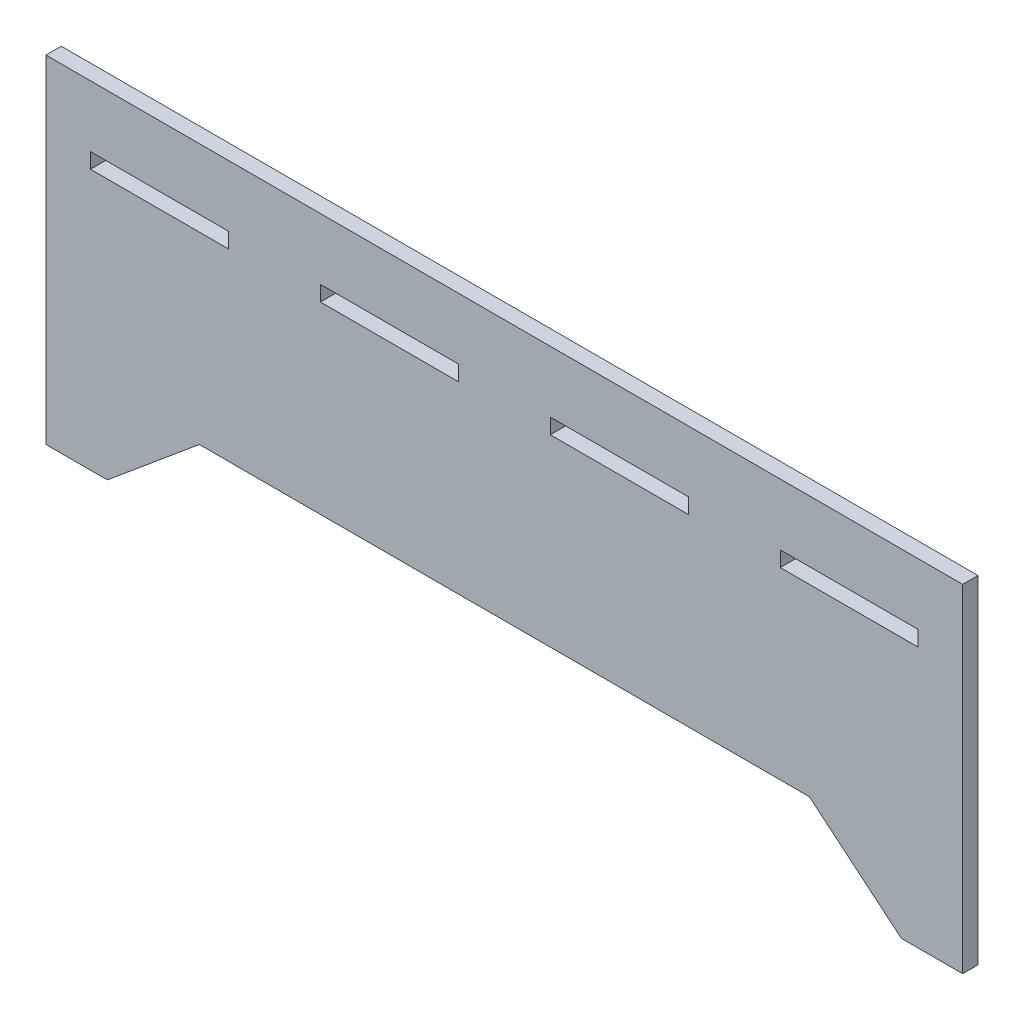
ISO-10303-21;
HEADER;
FILE_DESCRIPTION(('STEP AP214'),'2;1');
FILE_NAME('part.step','',(''),(''),'','','');
FILE_SCHEMA(('AUTOMOTIVE_DESIGN { 1 0 10303 214 1 1 1 1 }'));
ENDSEC;
DATA;
#1=APPLICATION_CONTEXT('core data for automotive mechanical design processes');
#2=APPLICATION_PROTOCOL_DEFINITION('international standard','automotive_design',2000,#1);
#3=PRODUCT_CONTEXT('',#1,'mechanical');
#4=PRODUCT('Part','Part','',(#3));
#5=PRODUCT_RELATED_PRODUCT_CATEGORY('part','',(#4));
#6=PRODUCT_DEFINITION_FORMATION('','',#4);
#7=PRODUCT_DEFINITION_CONTEXT('part definition',#1,'design');
#8=PRODUCT_DEFINITION('design','',#6,#7);
#9=PRODUCT_DEFINITION_SHAPE('','',#8);
#10=(LENGTH_UNIT() NAMED_UNIT(*) SI_UNIT(.MILLI.,.METRE.));
#11=(NAMED_UNIT(*) PLANE_ANGLE_UNIT() SI_UNIT($,.RADIAN.));
#12=(NAMED_UNIT(*) SI_UNIT($,.STERADIAN.) SOLID_ANGLE_UNIT());
#13=UNCERTAINTY_MEASURE_WITH_UNIT(LENGTH_MEASURE(1.E-05),#10,'distance_accuracy_value','');
#14=(GEOMETRIC_REPRESENTATION_CONTEXT(3) GLOBAL_UNCERTAINTY_ASSIGNED_CONTEXT((#13)) GLOBAL_UNIT_ASSIGNED_CONTEXT((#10,
#11,#12)) REPRESENTATION_CONTEXT('',''));
#15=CARTESIAN_POINT('',(0.,0.,0.));
#16=DIRECTION('',(0.,0.,1.));
#17=DIRECTION('',(1.,0.,0.));
#18=AXIS2_PLACEMENT_3D('',#15,#16,#17);
#19=CARTESIAN_POINT('',(0.,0.,10.));
#20=DIRECTION('',(0.,0.,1.));
#21=DIRECTION('',(1.,0.,0.));
#22=AXIS2_PLACEMENT_3D('',#19,#20,#21);
#23=PLANE('',#22);
#24=DIRECTION('',(1.,0.,0.));
#25=VECTOR('',#24,1.);
#26=CARTESIAN_POINT('',(29.,120.,10.));
#27=LINE('',#26,#25);
#28=CARTESIAN_POINT('',(29.,120.,10.));
#29=VERTEX_POINT('',#28);
#30=CARTESIAN_POINT('',(119.,120.,10.));
#31=VERTEX_POINT('',#30);
#32=EDGE_CURVE('E232',#29,#31,#27,.T.);
#33=ORIENTED_EDGE('',*,*,#32,.F.);
#34=DIRECTION('',(0.,-1.,0.));
#35=VECTOR('',#34,1.);
#36=CARTESIAN_POINT('',(29.,130.,10.));
#37=LINE('',#36,#35);
#38=CARTESIAN_POINT('',(29.,130.,10.));
#39=VERTEX_POINT('',#38);
#40=EDGE_CURVE('E230',#39,#29,#37,.T.);
#41=ORIENTED_EDGE('',*,*,#40,.F.);
#42=DIRECTION('',(-1.,0.,0.));
#43=VECTOR('',#42,1.);
#44=CARTESIAN_POINT('',(29.,130.,10.));
#45=LINE('',#44,#43);
#46=CARTESIAN_POINT('',(119.,130.,10.));
#47=VERTEX_POINT('',#46);
#48=EDGE_CURVE('E238',#47,#39,#45,.T.);
#49=ORIENTED_EDGE('',*,*,#48,.F.);
#50=DIRECTION('',(0.,1.,0.));
#51=VECTOR('',#50,1.);
#52=CARTESIAN_POINT('',(119.,130.,10.));
#53=LINE('',#52,#51);
#54=EDGE_CURVE('E235',#31,#47,#53,.T.);
#55=ORIENTED_EDGE('',*,*,#54,.F.);
#56=EDGE_LOOP('',(#33,#41,#49,#55));
#57=FACE_BOUND('',#56,.T.);
#58=DIRECTION('',(1.,0.,0.));
#59=VECTOR('',#58,1.);
#60=CARTESIAN_POINT('',(179.,120.,10.));
#61=LINE('',#60,#59);
#62=CARTESIAN_POINT('',(179.,120.,10.));
#63=VERTEX_POINT('',#62);
#64=CARTESIAN_POINT('',(269.,120.,10.));
#65=VERTEX_POINT('',#64);
#66=EDGE_CURVE('E294',#63,#65,#61,.T.);
#67=ORIENTED_EDGE('',*,*,#66,.F.);
#68=DIRECTION('',(0.,-1.,0.));
#69=VECTOR('',#68,1.);
#70=CARTESIAN_POINT('',(179.,130.,10.));
#71=LINE('',#70,#69);
#72=CARTESIAN_POINT('',(179.,130.,10.));
#73=VERTEX_POINT('',#72);
#74=EDGE_CURVE('E292',#73,#63,#71,.T.);
#75=ORIENTED_EDGE('',*,*,#74,.F.);
#76=DIRECTION('',(-1.,0.,0.));
#77=VECTOR('',#76,1.);
#78=CARTESIAN_POINT('',(179.,130.,10.));
#79=LINE('',#78,#77);
#80=CARTESIAN_POINT('',(269.,130.,10.));
#81=VERTEX_POINT('',#80);
#82=EDGE_CURVE('E300',#81,#73,#79,.T.);
#83=ORIENTED_EDGE('',*,*,#82,.F.);
#84=DIRECTION('',(0.,1.,0.));
#85=VECTOR('',#84,1.);
#86=CARTESIAN_POINT('',(269.,130.,10.));
#87=LINE('',#86,#85);
#88=EDGE_CURVE('E297',#65,#81,#87,.T.);
#89=ORIENTED_EDGE('',*,*,#88,.F.);
#90=EDGE_LOOP('',(#67,#75,#83,#89));
#91=FACE_BOUND('',#90,.T.);
#92=DIRECTION('',(0.,-1.,0.));
#93=VECTOR('',#92,1.);
#94=CARTESIAN_POINT('',(0.,0.,10.));
#95=LINE('',#94,#93);
#96=CARTESIAN_POINT('',(0.,170.,10.));
#97=VERTEX_POINT('',#96);
#98=CARTESIAN_POINT('',(0.,-50.,10.));
#99=VERTEX_POINT('',#98);
#100=EDGE_CURVE('E323',#97,#99,#95,.T.);
#101=ORIENTED_EDGE('',*,*,#100,.T.);
#102=DIRECTION('',(1.,0.,0.));
#103=VECTOR('',#102,1.);
#104=CARTESIAN_POINT('',(0.,-50.,10.));
#105=LINE('',#104,#103);
#106=CARTESIAN_POINT('',(40.,-50.,10.));
#107=VERTEX_POINT('',#106);
#108=EDGE_CURVE('E326',#99,#107,#105,.T.);
#109=ORIENTED_EDGE('',*,*,#108,.T.);
#110=DIRECTION('',(0.768221279597376,0.64018439966448,0.));
#111=VECTOR('',#110,1.);
#112=CARTESIAN_POINT('',(40.,-50.,10.));
#113=LINE('',#112,#111);
#114=CARTESIAN_POINT('',(100.,0.,10.));
#115=VERTEX_POINT('',#114);
#116=EDGE_CURVE('E329',#107,#115,#113,.T.);
#117=ORIENTED_EDGE('',*,*,#116,.T.);
#118=DIRECTION('',(1.,0.,0.));
#119=VECTOR('',#118,1.);
#120=CARTESIAN_POINT('',(100.,0.,10.));
#121=LINE('',#120,#119);
#122=CARTESIAN_POINT('',(498.,0.,10.));
#123=VERTEX_POINT('',#122);
#124=EDGE_CURVE('E331',#115,#123,#121,.T.);
#125=ORIENTED_EDGE('',*,*,#124,.T.);
#126=DIRECTION('',(0.768221279597376,-0.640184399664479,0.));
#127=VECTOR('',#126,1.);
#128=CARTESIAN_POINT('',(558.,-50.,10.));
#129=LINE('',#128,#127);
#130=CARTESIAN_POINT('',(558.,-50.,10.));
#131=VERTEX_POINT('',#130);
#132=EDGE_CURVE('E333',#123,#131,#129,.T.);
#133=ORIENTED_EDGE('',*,*,#132,.T.);
#134=DIRECTION('',(1.,0.,0.));
#135=VECTOR('',#134,1.);
#136=CARTESIAN_POINT('',(598.,-50.,10.));
#137=LINE('',#136,#135);
#138=CARTESIAN_POINT('',(598.,-50.,10.));
#139=VERTEX_POINT('',#138);
#140=EDGE_CURVE('E335',#131,#139,#137,.T.);
#141=ORIENTED_EDGE('',*,*,#140,.T.);
#142=DIRECTION('',(0.,1.,0.));
#143=VECTOR('',#142,1.);
#144=CARTESIAN_POINT('',(598.,0.,10.));
#145=LINE('',#144,#143);
#146=CARTESIAN_POINT('',(598.,170.,10.));
#147=VERTEX_POINT('',#146);
#148=EDGE_CURVE('E337',#139,#147,#145,.T.);
#149=ORIENTED_EDGE('',*,*,#148,.T.);
#150=DIRECTION('',(-1.,0.,0.));
#151=VECTOR('',#150,1.);
#152=CARTESIAN_POINT('',(0.,170.,10.));
#153=LINE('',#152,#151);
#154=EDGE_CURVE('E339',#147,#97,#153,.T.);
#155=ORIENTED_EDGE('',*,*,#154,.T.);
#156=EDGE_LOOP('',(#101,#109,#117,#125,#133,#141,#149,#155));
#157=FACE_BOUND('',#156,.T.);
#158=DIRECTION('',(1.,0.,0.));
#159=VECTOR('',#158,1.);
#160=CARTESIAN_POINT('',(329.,120.,10.));
#161=LINE('',#160,#159);
#162=CARTESIAN_POINT('',(329.,120.,10.));
#163=VERTEX_POINT('',#162);
#164=CARTESIAN_POINT('',(419.,120.,10.));
#165=VERTEX_POINT('',#164);
#166=EDGE_CURVE('E263',#163,#165,#161,.T.);
#167=ORIENTED_EDGE('',*,*,#166,.F.);
#168=DIRECTION('',(0.,-1.,0.));
#169=VECTOR('',#168,1.);
#170=CARTESIAN_POINT('',(329.,130.,10.));
#171=LINE('',#170,#169);
#172=CARTESIAN_POINT('',(329.,130.,10.));
#173=VERTEX_POINT('',#172);
#174=EDGE_CURVE('E261',#173,#163,#171,.T.);
#175=ORIENTED_EDGE('',*,*,#174,.F.);
#176=DIRECTION('',(-1.,0.,0.));
#177=VECTOR('',#176,1.);
#178=CARTESIAN_POINT('',(329.,130.,10.));
#179=LINE('',#178,#177);
#180=CARTESIAN_POINT('',(419.,130.,10.));
#181=VERTEX_POINT('',#180);
#182=EDGE_CURVE('E269',#181,#173,#179,.T.);
#183=ORIENTED_EDGE('',*,*,#182,.F.);
#184=DIRECTION('',(0.,1.,0.));
#185=VECTOR('',#184,1.);
#186=CARTESIAN_POINT('',(419.,130.,10.));
#187=LINE('',#186,#185);
#188=EDGE_CURVE('E266',#165,#181,#187,.T.);
#189=ORIENTED_EDGE('',*,*,#188,.F.);
#190=EDGE_LOOP('',(#167,#175,#183,#189));
#191=FACE_BOUND('',#190,.T.);
#192=DIRECTION('',(1.,0.,0.));
#193=VECTOR('',#192,1.);
#194=CARTESIAN_POINT('',(479.,120.,10.));
#195=LINE('',#194,#193);
#196=CARTESIAN_POINT('',(479.,120.,10.));
#197=VERTEX_POINT('',#196);
#198=CARTESIAN_POINT('',(569.,120.,10.));
#199=VERTEX_POINT('',#198);
#200=EDGE_CURVE('E202',#197,#199,#195,.T.);
#201=ORIENTED_EDGE('',*,*,#200,.F.);
#202=DIRECTION('',(0.,-1.,0.));
#203=VECTOR('',#202,1.);
#204=CARTESIAN_POINT('',(479.,130.,10.));
#205=LINE('',#204,#203);
#206=CARTESIAN_POINT('',(479.,130.,10.));
#207=VERTEX_POINT('',#206);
#208=EDGE_CURVE('E194',#207,#197,#205,.T.);
#209=ORIENTED_EDGE('',*,*,#208,.F.);
#210=DIRECTION('',(-1.,0.,0.));
#211=VECTOR('',#210,1.);
#212=CARTESIAN_POINT('',(479.,130.,10.));
#213=LINE('',#212,#211);
#214=CARTESIAN_POINT('',(569.,130.,10.));
#215=VERTEX_POINT('',#214);
#216=EDGE_CURVE('E216',#215,#207,#213,.T.);
#217=ORIENTED_EDGE('',*,*,#216,.F.);
#218=DIRECTION('',(0.,1.,0.));
#219=VECTOR('',#218,1.);
#220=CARTESIAN_POINT('',(569.,130.,10.));
#221=LINE('',#220,#219);
#222=EDGE_CURVE('E214',#199,#215,#221,.T.);
#223=ORIENTED_EDGE('',*,*,#222,.F.);
#224=EDGE_LOOP('',(#201,#209,#217,#223));
#225=FACE_BOUND('',#224,.T.);
#226=ADVANCED_FACE('F33',(#57,#91,#157,#191,#225),#23,.T.);
#227=CARTESIAN_POINT('',(0.,0.,0.));
#228=DIRECTION('',(0.,0.,1.));
#229=DIRECTION('',(1.,0.,0.));
#230=AXIS2_PLACEMENT_3D('',#227,#228,#229);
#231=PLANE('',#230);
#232=DIRECTION('',(0.,-1.,0.));
#233=VECTOR('',#232,1.);
#234=CARTESIAN_POINT('',(29.,130.,0.));
#235=LINE('',#234,#233);
#236=CARTESIAN_POINT('',(29.,130.,0.));
#237=VERTEX_POINT('',#236);
#238=CARTESIAN_POINT('',(29.,120.,0.));
#239=VERTEX_POINT('',#238);
#240=EDGE_CURVE('E210',#237,#239,#235,.T.);
#241=ORIENTED_EDGE('',*,*,#240,.T.);
#242=DIRECTION('',(1.,0.,0.));
#243=VECTOR('',#242,1.);
#244=CARTESIAN_POINT('',(29.,120.,0.));
#245=LINE('',#244,#243);
#246=CARTESIAN_POINT('',(119.,120.,0.));
#247=VERTEX_POINT('',#246);
#248=EDGE_CURVE('E243',#239,#247,#245,.T.);
#249=ORIENTED_EDGE('',*,*,#248,.T.);
#250=DIRECTION('',(0.,1.,0.));
#251=VECTOR('',#250,1.);
#252=CARTESIAN_POINT('',(119.,130.,0.));
#253=LINE('',#252,#251);
#254=CARTESIAN_POINT('',(119.,130.,0.));
#255=VERTEX_POINT('',#254);
#256=EDGE_CURVE('E246',#247,#255,#253,.T.);
#257=ORIENTED_EDGE('',*,*,#256,.T.);
#258=DIRECTION('',(-1.,0.,0.));
#259=VECTOR('',#258,1.);
#260=CARTESIAN_POINT('',(29.,130.,0.));
#261=LINE('',#260,#259);
#262=EDGE_CURVE('E233',#255,#237,#261,.T.);
#263=ORIENTED_EDGE('',*,*,#262,.T.);
#264=EDGE_LOOP('',(#241,#249,#257,#263));
#265=FACE_BOUND('',#264,.T.);
#266=DIRECTION('',(0.,-1.,0.));
#267=VECTOR('',#266,1.);
#268=CARTESIAN_POINT('',(179.,130.,0.));
#269=LINE('',#268,#267);
#270=CARTESIAN_POINT('',(179.,130.,0.));
#271=VERTEX_POINT('',#270);
#272=CARTESIAN_POINT('',(179.,120.,0.));
#273=VERTEX_POINT('',#272);
#274=EDGE_CURVE('E291',#271,#273,#269,.T.);
#275=ORIENTED_EDGE('',*,*,#274,.T.);
#276=DIRECTION('',(1.,0.,0.));
#277=VECTOR('',#276,1.);
#278=CARTESIAN_POINT('',(179.,120.,0.));
#279=LINE('',#278,#277);
#280=CARTESIAN_POINT('',(269.,120.,0.));
#281=VERTEX_POINT('',#280);
#282=EDGE_CURVE('E305',#273,#281,#279,.T.);
#283=ORIENTED_EDGE('',*,*,#282,.T.);
#284=DIRECTION('',(0.,1.,0.));
#285=VECTOR('',#284,1.);
#286=CARTESIAN_POINT('',(269.,130.,0.));
#287=LINE('',#286,#285);
#288=CARTESIAN_POINT('',(269.,130.,0.));
#289=VERTEX_POINT('',#288);
#290=EDGE_CURVE('E308',#281,#289,#287,.T.);
#291=ORIENTED_EDGE('',*,*,#290,.T.);
#292=DIRECTION('',(-1.,0.,0.));
#293=VECTOR('',#292,1.);
#294=CARTESIAN_POINT('',(179.,130.,0.));
#295=LINE('',#294,#293);
#296=EDGE_CURVE('E295',#289,#271,#295,.T.);
#297=ORIENTED_EDGE('',*,*,#296,.T.);
#298=EDGE_LOOP('',(#275,#283,#291,#297));
#299=FACE_BOUND('',#298,.T.);
#300=DIRECTION('',(1.,0.,0.));
#301=VECTOR('',#300,1.);
#302=CARTESIAN_POINT('',(0.,-50.,0.));
#303=LINE('',#302,#301);
#304=CARTESIAN_POINT('',(0.,-50.,0.));
#305=VERTEX_POINT('',#304);
#306=CARTESIAN_POINT('',(40.,-50.,0.));
#307=VERTEX_POINT('',#306);
#308=EDGE_CURVE('E322',#305,#307,#303,.T.);
#309=ORIENTED_EDGE('',*,*,#308,.F.);
#310=DIRECTION('',(0.,-1.,0.));
#311=VECTOR('',#310,1.);
#312=CARTESIAN_POINT('',(0.,0.,0.));
#313=LINE('',#312,#311);
#314=CARTESIAN_POINT('',(0.,170.,0.));
#315=VERTEX_POINT('',#314);
#316=EDGE_CURVE('E327',#315,#305,#313,.T.);
#317=ORIENTED_EDGE('',*,*,#316,.F.);
#318=DIRECTION('',(-1.,0.,0.));
#319=VECTOR('',#318,1.);
#320=CARTESIAN_POINT('',(0.,170.,0.));
#321=LINE('',#320,#319);
#322=CARTESIAN_POINT('',(598.,170.,0.));
#323=VERTEX_POINT('',#322);
#324=EDGE_CURVE('E355',#323,#315,#321,.T.);
#325=ORIENTED_EDGE('',*,*,#324,.F.);
#326=DIRECTION('',(0.,1.,0.));
#327=VECTOR('',#326,1.);
#328=CARTESIAN_POINT('',(598.,0.,0.));
#329=LINE('',#328,#327);
#330=CARTESIAN_POINT('',(598.,-50.,0.));
#331=VERTEX_POINT('',#330);
#332=EDGE_CURVE('E353',#331,#323,#329,.T.);
#333=ORIENTED_EDGE('',*,*,#332,.F.);
#334=DIRECTION('',(1.,0.,0.));
#335=VECTOR('',#334,1.);
#336=CARTESIAN_POINT('',(598.,-50.,0.));
#337=LINE('',#336,#335);
#338=CARTESIAN_POINT('',(558.,-50.,0.));
#339=VERTEX_POINT('',#338);
#340=EDGE_CURVE('E350',#339,#331,#337,.T.);
#341=ORIENTED_EDGE('',*,*,#340,.F.);
#342=DIRECTION('',(0.768221279597376,-0.640184399664479,0.));
#343=VECTOR('',#342,1.);
#344=CARTESIAN_POINT('',(558.,-50.,0.));
#345=LINE('',#344,#343);
#346=CARTESIAN_POINT('',(498.,0.,0.));
#347=VERTEX_POINT('',#346);
#348=EDGE_CURVE('E348',#347,#339,#345,.T.);
#349=ORIENTED_EDGE('',*,*,#348,.F.);
#350=DIRECTION('',(1.,0.,0.));
#351=VECTOR('',#350,1.);
#352=CARTESIAN_POINT('',(100.,0.,0.));
#353=LINE('',#352,#351);
#354=CARTESIAN_POINT('',(100.,0.,0.));
#355=VERTEX_POINT('',#354);
#356=EDGE_CURVE('E346',#355,#347,#353,.T.);
#357=ORIENTED_EDGE('',*,*,#356,.F.);
#358=DIRECTION('',(0.768221279597376,0.64018439966448,0.));
#359=VECTOR('',#358,1.);
#360=CARTESIAN_POINT('',(40.,-50.,0.));
#361=LINE('',#360,#359);
#362=EDGE_CURVE('E344',#307,#355,#361,.T.);
#363=ORIENTED_EDGE('',*,*,#362,.F.);
#364=EDGE_LOOP('',(#309,#317,#325,#333,#341,#349,#357,#363));
#365=FACE_BOUND('',#364,.T.);
#366=DIRECTION('',(0.,-1.,0.));
#367=VECTOR('',#366,1.);
#368=CARTESIAN_POINT('',(329.,130.,0.));
#369=LINE('',#368,#367);
#370=CARTESIAN_POINT('',(329.,130.,0.));
#371=VERTEX_POINT('',#370);
#372=CARTESIAN_POINT('',(329.,120.,0.));
#373=VERTEX_POINT('',#372);
#374=EDGE_CURVE('E260',#371,#373,#369,.T.);
#375=ORIENTED_EDGE('',*,*,#374,.T.);
#376=DIRECTION('',(1.,0.,0.));
#377=VECTOR('',#376,1.);
#378=CARTESIAN_POINT('',(329.,120.,0.));
#379=LINE('',#378,#377);
#380=CARTESIAN_POINT('',(419.,120.,0.));
#381=VERTEX_POINT('',#380);
#382=EDGE_CURVE('E274',#373,#381,#379,.T.);
#383=ORIENTED_EDGE('',*,*,#382,.T.);
#384=DIRECTION('',(0.,1.,0.));
#385=VECTOR('',#384,1.);
#386=CARTESIAN_POINT('',(419.,130.,0.));
#387=LINE('',#386,#385);
#388=CARTESIAN_POINT('',(419.,130.,0.));
#389=VERTEX_POINT('',#388);
#390=EDGE_CURVE('E277',#381,#389,#387,.T.);
#391=ORIENTED_EDGE('',*,*,#390,.T.);
#392=DIRECTION('',(-1.,0.,0.));
#393=VECTOR('',#392,1.);
#394=CARTESIAN_POINT('',(329.,130.,0.));
#395=LINE('',#394,#393);
#396=EDGE_CURVE('E264',#389,#371,#395,.T.);
#397=ORIENTED_EDGE('',*,*,#396,.T.);
#398=EDGE_LOOP('',(#375,#383,#391,#397));
#399=FACE_BOUND('',#398,.T.);
#400=DIRECTION('',(0.,-1.,0.));
#401=VECTOR('',#400,1.);
#402=CARTESIAN_POINT('',(479.,130.,0.));
#403=LINE('',#402,#401);
#404=CARTESIAN_POINT('',(479.,130.,0.));
#405=VERTEX_POINT('',#404);
#406=CARTESIAN_POINT('',(479.,120.,0.));
#407=VERTEX_POINT('',#406);
#408=EDGE_CURVE('E56',#405,#407,#403,.T.);
#409=ORIENTED_EDGE('',*,*,#408,.T.);
#410=DIRECTION('',(1.,0.,0.));
#411=VECTOR('',#410,1.);
#412=CARTESIAN_POINT('',(479.,120.,0.));
#413=LINE('',#412,#411);
#414=CARTESIAN_POINT('',(569.,120.,0.));
#415=VERTEX_POINT('',#414);
#416=EDGE_CURVE('E209',#407,#415,#413,.T.);
#417=ORIENTED_EDGE('',*,*,#416,.T.);
#418=DIRECTION('',(0.,1.,0.));
#419=VECTOR('',#418,1.);
#420=CARTESIAN_POINT('',(569.,130.,0.));
#421=LINE('',#420,#419);
#422=CARTESIAN_POINT('',(569.,130.,0.));
#423=VERTEX_POINT('',#422);
#424=EDGE_CURVE('E222',#415,#423,#421,.T.);
#425=ORIENTED_EDGE('',*,*,#424,.T.);
#426=DIRECTION('',(-1.,0.,0.));
#427=VECTOR('',#426,1.);
#428=CARTESIAN_POINT('',(479.,130.,0.));
#429=LINE('',#428,#427);
#430=EDGE_CURVE('E203',#423,#405,#429,.T.);
#431=ORIENTED_EDGE('',*,*,#430,.T.);
#432=EDGE_LOOP('',(#409,#417,#425,#431));
#433=FACE_BOUND('',#432,.T.);
#434=ADVANCED_FACE('F385',(#265,#299,#365,#399,#433),#231,.F.);
#435=CARTESIAN_POINT('',(0.,-50.,10.));
#436=DIRECTION('',(0.,1.,0.));
#437=DIRECTION('',(0.,0.,1.));
#438=AXIS2_PLACEMENT_3D('',#435,#436,#437);
#439=PLANE('',#438);
#440=ORIENTED_EDGE('',*,*,#308,.T.);
#441=DIRECTION('',(0.,0.,-1.));
#442=VECTOR('',#441,1.);
#443=CARTESIAN_POINT('',(40.,-50.,10.));
#444=LINE('',#443,#442);
#445=EDGE_CURVE('E41',#107,#307,#444,.T.);
#446=ORIENTED_EDGE('',*,*,#445,.F.);
#447=ORIENTED_EDGE('',*,*,#108,.F.);
#448=DIRECTION('',(0.,0.,-1.));
#449=VECTOR('',#448,1.);
#450=CARTESIAN_POINT('',(0.,-50.,10.));
#451=LINE('',#450,#449);
#452=EDGE_CURVE('E11',#99,#305,#451,.T.);
#453=ORIENTED_EDGE('',*,*,#452,.T.);
#454=EDGE_LOOP('',(#440,#446,#447,#453));
#455=FACE_BOUND('',#454,.T.);
#456=ADVANCED_FACE('F35',(#455),#439,.F.);
#457=CARTESIAN_POINT('',(40.,-50.,10.));
#458=DIRECTION('',(-0.64018439966448,0.768221279597376,0.));
#459=DIRECTION('',(-0.768221279597376,-0.64018439966448,0.));
#460=AXIS2_PLACEMENT_3D('',#457,#458,#459);
#461=PLANE('',#460);
#462=ORIENTED_EDGE('',*,*,#362,.T.);
#463=DIRECTION('',(0.,0.,-1.));
#464=VECTOR('',#463,1.);
#465=CARTESIAN_POINT('',(100.,0.,10.));
#466=LINE('',#465,#464);
#467=EDGE_CURVE('E372',#115,#355,#466,.T.);
#468=ORIENTED_EDGE('',*,*,#467,.F.);
#469=ORIENTED_EDGE('',*,*,#116,.F.);
#470=ORIENTED_EDGE('',*,*,#445,.T.);
#471=EDGE_LOOP('',(#462,#468,#469,#470));
#472=FACE_BOUND('',#471,.T.);
#473=ADVANCED_FACE('F379',(#472),#461,.F.);
#474=CARTESIAN_POINT('',(100.,0.,10.));
#475=DIRECTION('',(0.,1.,0.));
#476=DIRECTION('',(0.,0.,1.));
#477=AXIS2_PLACEMENT_3D('',#474,#475,#476);
#478=PLANE('',#477);
#479=ORIENTED_EDGE('',*,*,#356,.T.);
#480=DIRECTION('',(0.,0.,-1.));
#481=VECTOR('',#480,1.);
#482=CARTESIAN_POINT('',(498.,0.,10.));
#483=LINE('',#482,#481);
#484=EDGE_CURVE('E369',#123,#347,#483,.T.);
#485=ORIENTED_EDGE('',*,*,#484,.F.);
#486=ORIENTED_EDGE('',*,*,#124,.F.);
#487=ORIENTED_EDGE('',*,*,#467,.T.);
#488=EDGE_LOOP('',(#479,#485,#486,#487));
#489=FACE_BOUND('',#488,.T.);
#490=ADVANCED_FACE('F392',(#489),#478,.F.);
#491=CARTESIAN_POINT('',(558.,-50.,10.));
#492=DIRECTION('',(0.640184399664479,0.768221279597376,0.));
#493=DIRECTION('',(-0.768221279597376,0.640184399664479,0.));
#494=AXIS2_PLACEMENT_3D('',#491,#492,#493);
#495=PLANE('',#494);
#496=ORIENTED_EDGE('',*,*,#348,.T.);
#497=DIRECTION('',(0.,0.,-1.));
#498=VECTOR('',#497,1.);
#499=CARTESIAN_POINT('',(558.,-50.,10.));
#500=LINE('',#499,#498);
#501=EDGE_CURVE('E366',#131,#339,#500,.T.);
#502=ORIENTED_EDGE('',*,*,#501,.F.);
#503=ORIENTED_EDGE('',*,*,#132,.F.);
#504=ORIENTED_EDGE('',*,*,#484,.T.);
#505=EDGE_LOOP('',(#496,#502,#503,#504));
#506=FACE_BOUND('',#505,.T.);
#507=ADVANCED_FACE('F396',(#506),#495,.F.);
#508=CARTESIAN_POINT('',(598.,-50.,10.));
#509=DIRECTION('',(0.,1.,0.));
#510=DIRECTION('',(0.,0.,1.));
#511=AXIS2_PLACEMENT_3D('',#508,#509,#510);
#512=PLANE('',#511);
#513=ORIENTED_EDGE('',*,*,#340,.T.);
#514=DIRECTION('',(0.,0.,-1.));
#515=VECTOR('',#514,1.);
#516=CARTESIAN_POINT('',(598.,-50.,10.));
#517=LINE('',#516,#515);
#518=EDGE_CURVE('E363',#139,#331,#517,.T.);
#519=ORIENTED_EDGE('',*,*,#518,.F.);
#520=ORIENTED_EDGE('',*,*,#140,.F.);
#521=ORIENTED_EDGE('',*,*,#501,.T.);
#522=EDGE_LOOP('',(#513,#519,#520,#521));
#523=FACE_BOUND('',#522,.T.);
#524=ADVANCED_FACE('F415',(#523),#512,.F.);
#525=CARTESIAN_POINT('',(598.,0.,10.));
#526=DIRECTION('',(-1.,0.,0.));
#527=DIRECTION('',(0.,0.,1.));
#528=AXIS2_PLACEMENT_3D('',#525,#526,#527);
#529=PLANE('',#528);
#530=ORIENTED_EDGE('',*,*,#332,.T.);
#531=DIRECTION('',(0.,0.,-1.));
#532=VECTOR('',#531,1.);
#533=CARTESIAN_POINT('',(598.,170.,10.));
#534=LINE('',#533,#532);
#535=EDGE_CURVE('E360',#147,#323,#534,.T.);
#536=ORIENTED_EDGE('',*,*,#535,.F.);
#537=ORIENTED_EDGE('',*,*,#148,.F.);
#538=ORIENTED_EDGE('',*,*,#518,.T.);
#539=EDGE_LOOP('',(#530,#536,#537,#538));
#540=FACE_BOUND('',#539,.T.);
#541=ADVANCED_FACE('F413',(#540),#529,.F.);
#542=CARTESIAN_POINT('',(0.,170.,10.));
#543=DIRECTION('',(0.,-1.,0.));
#544=DIRECTION('',(1.,0.,0.));
#545=AXIS2_PLACEMENT_3D('',#542,#543,#544);
#546=PLANE('',#545);
#547=ORIENTED_EDGE('',*,*,#324,.T.);
#548=DIRECTION('',(0.,0.,-1.));
#549=VECTOR('',#548,1.);
#550=CARTESIAN_POINT('',(0.,170.,10.));
#551=LINE('',#550,#549);
#552=EDGE_CURVE('E342',#97,#315,#551,.T.);
#553=ORIENTED_EDGE('',*,*,#552,.F.);
#554=ORIENTED_EDGE('',*,*,#154,.F.);
#555=ORIENTED_EDGE('',*,*,#535,.T.);
#556=EDGE_LOOP('',(#547,#553,#554,#555));
#557=FACE_BOUND('',#556,.T.);
#558=ADVANCED_FACE('F408',(#557),#546,.F.);
#559=CARTESIAN_POINT('',(0.,0.,10.));
#560=DIRECTION('',(1.,0.,0.));
#561=DIRECTION('',(0.,0.,-1.));
#562=AXIS2_PLACEMENT_3D('',#559,#560,#561);
#563=PLANE('',#562);
#564=ORIENTED_EDGE('',*,*,#316,.T.);
#565=ORIENTED_EDGE('',*,*,#452,.F.);
#566=ORIENTED_EDGE('',*,*,#100,.F.);
#567=ORIENTED_EDGE('',*,*,#552,.T.);
#568=EDGE_LOOP('',(#564,#565,#566,#567));
#569=FACE_BOUND('',#568,.T.);
#570=ADVANCED_FACE('F404',(#569),#563,.F.);
#571=CARTESIAN_POINT('',(179.,130.,10.));
#572=DIRECTION('',(1.,0.,0.));
#573=DIRECTION('',(0.,0.,-1.));
#574=AXIS2_PLACEMENT_3D('',#571,#572,#573);
#575=PLANE('',#574);
#576=ORIENTED_EDGE('',*,*,#274,.F.);
#577=DIRECTION('',(0.,0.,-1.));
#578=VECTOR('',#577,1.);
#579=CARTESIAN_POINT('',(179.,130.,10.));
#580=LINE('',#579,#578);
#581=EDGE_CURVE('E302',#73,#271,#580,.T.);
#582=ORIENTED_EDGE('',*,*,#581,.F.);
#583=ORIENTED_EDGE('',*,*,#74,.T.);
#584=DIRECTION('',(0.,0.,-1.));
#585=VECTOR('',#584,1.);
#586=CARTESIAN_POINT('',(179.,120.,10.));
#587=LINE('',#586,#585);
#588=EDGE_CURVE('E319',#63,#273,#587,.T.);
#589=ORIENTED_EDGE('',*,*,#588,.T.);
#590=EDGE_LOOP('',(#576,#582,#583,#589));
#591=FACE_BOUND('',#590,.T.);
#592=ADVANCED_FACE('F435',(#591),#575,.T.);
#593=CARTESIAN_POINT('',(179.,120.,10.));
#594=DIRECTION('',(0.,1.,0.));
#595=DIRECTION('',(-1.,0.,0.));
#596=AXIS2_PLACEMENT_3D('',#593,#594,#595);
#597=PLANE('',#596);
#598=ORIENTED_EDGE('',*,*,#282,.F.);
#599=ORIENTED_EDGE('',*,*,#588,.F.);
#600=ORIENTED_EDGE('',*,*,#66,.T.);
#601=DIRECTION('',(0.,0.,-1.));
#602=VECTOR('',#601,1.);
#603=CARTESIAN_POINT('',(269.,120.,10.));
#604=LINE('',#603,#602);
#605=EDGE_CURVE('E317',#65,#281,#604,.T.);
#606=ORIENTED_EDGE('',*,*,#605,.T.);
#607=EDGE_LOOP('',(#598,#599,#600,#606));
#608=FACE_BOUND('',#607,.T.);
#609=ADVANCED_FACE('F455',(#608),#597,.T.);
#610=CARTESIAN_POINT('',(269.,130.,10.));
#611=DIRECTION('',(-1.,0.,0.));
#612=DIRECTION('',(0.,0.,1.));
#613=AXIS2_PLACEMENT_3D('',#610,#611,#612);
#614=PLANE('',#613);
#615=ORIENTED_EDGE('',*,*,#290,.F.);
#616=ORIENTED_EDGE('',*,*,#605,.F.);
#617=ORIENTED_EDGE('',*,*,#88,.T.);
#618=DIRECTION('',(0.,0.,-1.));
#619=VECTOR('',#618,1.);
#620=CARTESIAN_POINT('',(269.,130.,10.));
#621=LINE('',#620,#619);
#622=EDGE_CURVE('E315',#81,#289,#621,.T.);
#623=ORIENTED_EDGE('',*,*,#622,.T.);
#624=EDGE_LOOP('',(#615,#616,#617,#623));
#625=FACE_BOUND('',#624,.T.);
#626=ADVANCED_FACE('F462',(#625),#614,.T.);
#627=CARTESIAN_POINT('',(179.,130.,10.));
#628=DIRECTION('',(0.,-1.,0.));
#629=DIRECTION('',(0.,0.,-1.));
#630=AXIS2_PLACEMENT_3D('',#627,#628,#629);
#631=PLANE('',#630);
#632=ORIENTED_EDGE('',*,*,#296,.F.);
#633=ORIENTED_EDGE('',*,*,#622,.F.);
#634=ORIENTED_EDGE('',*,*,#82,.T.);
#635=ORIENTED_EDGE('',*,*,#581,.T.);
#636=EDGE_LOOP('',(#632,#633,#634,#635));
#637=FACE_BOUND('',#636,.T.);
#638=ADVANCED_FACE('F469',(#637),#631,.T.);
#639=CARTESIAN_POINT('',(329.,130.,10.));
#640=DIRECTION('',(1.,0.,0.));
#641=DIRECTION('',(0.,0.,-1.));
#642=AXIS2_PLACEMENT_3D('',#639,#640,#641);
#643=PLANE('',#642);
#644=ORIENTED_EDGE('',*,*,#374,.F.);
#645=DIRECTION('',(0.,0.,-1.));
#646=VECTOR('',#645,1.);
#647=CARTESIAN_POINT('',(329.,130.,10.));
#648=LINE('',#647,#646);
#649=EDGE_CURVE('E271',#173,#371,#648,.T.);
#650=ORIENTED_EDGE('',*,*,#649,.F.);
#651=ORIENTED_EDGE('',*,*,#174,.T.);
#652=DIRECTION('',(0.,0.,-1.));
#653=VECTOR('',#652,1.);
#654=CARTESIAN_POINT('',(329.,120.,10.));
#655=LINE('',#654,#653);
#656=EDGE_CURVE('E288',#163,#373,#655,.T.);
#657=ORIENTED_EDGE('',*,*,#656,.T.);
#658=EDGE_LOOP('',(#644,#650,#651,#657));
#659=FACE_BOUND('',#658,.T.);
#660=ADVANCED_FACE('F477',(#659),#643,.T.);
#661=CARTESIAN_POINT('',(329.,120.,10.));
#662=DIRECTION('',(0.,1.,0.));
#663=DIRECTION('',(-1.,0.,0.));
#664=AXIS2_PLACEMENT_3D('',#661,#662,#663);
#665=PLANE('',#664);
#666=ORIENTED_EDGE('',*,*,#382,.F.);
#667=ORIENTED_EDGE('',*,*,#656,.F.);
#668=ORIENTED_EDGE('',*,*,#166,.T.);
#669=DIRECTION('',(0.,0.,-1.));
#670=VECTOR('',#669,1.);
#671=CARTESIAN_POINT('',(419.,120.,10.));
#672=LINE('',#671,#670);
#673=EDGE_CURVE('E286',#165,#381,#672,.T.);
#674=ORIENTED_EDGE('',*,*,#673,.T.);
#675=EDGE_LOOP('',(#666,#667,#668,#674));
#676=FACE_BOUND('',#675,.T.);
#677=ADVANCED_FACE('F485',(#676),#665,.T.);
#678=CARTESIAN_POINT('',(419.,130.,10.));
#679=DIRECTION('',(-1.,0.,0.));
#680=DIRECTION('',(0.,0.,1.));
#681=AXIS2_PLACEMENT_3D('',#678,#679,#680);
#682=PLANE('',#681);
#683=ORIENTED_EDGE('',*,*,#390,.F.);
#684=ORIENTED_EDGE('',*,*,#673,.F.);
#685=ORIENTED_EDGE('',*,*,#188,.T.);
#686=DIRECTION('',(0.,0.,-1.));
#687=VECTOR('',#686,1.);
#688=CARTESIAN_POINT('',(419.,130.,10.));
#689=LINE('',#688,#687);
#690=EDGE_CURVE('E284',#181,#389,#689,.T.);
#691=ORIENTED_EDGE('',*,*,#690,.T.);
#692=EDGE_LOOP('',(#683,#684,#685,#691));
#693=FACE_BOUND('',#692,.T.);
#694=ADVANCED_FACE('F493',(#693),#682,.T.);
#695=CARTESIAN_POINT('',(329.,130.,10.));
#696=DIRECTION('',(0.,-1.,0.));
#697=DIRECTION('',(0.,0.,-1.));
#698=AXIS2_PLACEMENT_3D('',#695,#696,#697);
#699=PLANE('',#698);
#700=ORIENTED_EDGE('',*,*,#396,.F.);
#701=ORIENTED_EDGE('',*,*,#690,.F.);
#702=ORIENTED_EDGE('',*,*,#182,.T.);
#703=ORIENTED_EDGE('',*,*,#649,.T.);
#704=EDGE_LOOP('',(#700,#701,#702,#703));
#705=FACE_BOUND('',#704,.T.);
#706=ADVANCED_FACE('F501',(#705),#699,.T.);
#707=CARTESIAN_POINT('',(29.,130.,10.));
#708=DIRECTION('',(1.,0.,0.));
#709=DIRECTION('',(0.,1.,0.));
#710=AXIS2_PLACEMENT_3D('',#707,#708,#709);
#711=PLANE('',#710);
#712=ORIENTED_EDGE('',*,*,#240,.F.);
#713=DIRECTION('',(0.,0.,-1.));
#714=VECTOR('',#713,1.);
#715=CARTESIAN_POINT('',(29.,130.,10.));
#716=LINE('',#715,#714);
#717=EDGE_CURVE('E240',#39,#237,#716,.T.);
#718=ORIENTED_EDGE('',*,*,#717,.F.);
#719=ORIENTED_EDGE('',*,*,#40,.T.);
#720=DIRECTION('',(0.,0.,-1.));
#721=VECTOR('',#720,1.);
#722=CARTESIAN_POINT('',(29.,120.,10.));
#723=LINE('',#722,#721);
#724=EDGE_CURVE('E257',#29,#239,#723,.T.);
#725=ORIENTED_EDGE('',*,*,#724,.T.);
#726=EDGE_LOOP('',(#712,#718,#719,#725));
#727=FACE_BOUND('',#726,.T.);
#728=ADVANCED_FACE('F509',(#727),#711,.T.);
#729=CARTESIAN_POINT('',(29.,120.,10.));
#730=DIRECTION('',(0.,1.,0.));
#731=DIRECTION('',(0.,0.,1.));
#732=AXIS2_PLACEMENT_3D('',#729,#730,#731);
#733=PLANE('',#732);
#734=ORIENTED_EDGE('',*,*,#248,.F.);
#735=ORIENTED_EDGE('',*,*,#724,.F.);
#736=ORIENTED_EDGE('',*,*,#32,.T.);
#737=DIRECTION('',(0.,0.,-1.));
#738=VECTOR('',#737,1.);
#739=CARTESIAN_POINT('',(119.,120.,10.));
#740=LINE('',#739,#738);
#741=EDGE_CURVE('E255',#31,#247,#740,.T.);
#742=ORIENTED_EDGE('',*,*,#741,.T.);
#743=EDGE_LOOP('',(#734,#735,#736,#742));
#744=FACE_BOUND('',#743,.T.);
#745=ADVANCED_FACE('F517',(#744),#733,.T.);
#746=CARTESIAN_POINT('',(119.,130.,10.));
#747=DIRECTION('',(-1.,0.,0.));
#748=DIRECTION('',(0.,0.,1.));
#749=AXIS2_PLACEMENT_3D('',#746,#747,#748);
#750=PLANE('',#749);
#751=ORIENTED_EDGE('',*,*,#256,.F.);
#752=ORIENTED_EDGE('',*,*,#741,.F.);
#753=ORIENTED_EDGE('',*,*,#54,.T.);
#754=DIRECTION('',(0.,0.,-1.));
#755=VECTOR('',#754,1.);
#756=CARTESIAN_POINT('',(119.,130.,10.));
#757=LINE('',#756,#755);
#758=EDGE_CURVE('E253',#47,#255,#757,.T.);
#759=ORIENTED_EDGE('',*,*,#758,.T.);
#760=EDGE_LOOP('',(#751,#752,#753,#759));
#761=FACE_BOUND('',#760,.T.);
#762=ADVANCED_FACE('F525',(#761),#750,.T.);
#763=CARTESIAN_POINT('',(29.,130.,10.));
#764=DIRECTION('',(0.,-1.,0.));
#765=DIRECTION('',(0.,0.,-1.));
#766=AXIS2_PLACEMENT_3D('',#763,#764,#765);
#767=PLANE('',#766);
#768=ORIENTED_EDGE('',*,*,#262,.F.);
#769=ORIENTED_EDGE('',*,*,#758,.F.);
#770=ORIENTED_EDGE('',*,*,#48,.T.);
#771=ORIENTED_EDGE('',*,*,#717,.T.);
#772=EDGE_LOOP('',(#768,#769,#770,#771));
#773=FACE_BOUND('',#772,.T.);
#774=ADVANCED_FACE('F533',(#773),#767,.T.);
#775=CARTESIAN_POINT('',(479.,130.,10.));
#776=DIRECTION('',(1.,0.,0.));
#777=DIRECTION('',(0.,0.,-1.));
#778=AXIS2_PLACEMENT_3D('',#775,#776,#777);
#779=PLANE('',#778);
#780=ORIENTED_EDGE('',*,*,#408,.F.);
#781=DIRECTION('',(0.,0.,-1.));
#782=VECTOR('',#781,1.);
#783=CARTESIAN_POINT('',(479.,130.,10.));
#784=LINE('',#783,#782);
#785=EDGE_CURVE('E198',#207,#405,#784,.T.);
#786=ORIENTED_EDGE('',*,*,#785,.F.);
#787=ORIENTED_EDGE('',*,*,#208,.T.);
#788=DIRECTION('',(0.,0.,-1.));
#789=VECTOR('',#788,1.);
#790=CARTESIAN_POINT('',(479.,120.,10.));
#791=LINE('',#790,#789);
#792=EDGE_CURVE('E197',#197,#407,#791,.T.);
#793=ORIENTED_EDGE('',*,*,#792,.T.);
#794=EDGE_LOOP('',(#780,#786,#787,#793));
#795=FACE_BOUND('',#794,.T.);
#796=ADVANCED_FACE('F196',(#795),#779,.T.);
#797=CARTESIAN_POINT('',(479.,120.,10.));
#798=DIRECTION('',(0.,1.,0.));
#799=DIRECTION('',(0.,0.,1.));
#800=AXIS2_PLACEMENT_3D('',#797,#798,#799);
#801=PLANE('',#800);
#802=ORIENTED_EDGE('',*,*,#416,.F.);
#803=ORIENTED_EDGE('',*,*,#792,.F.);
#804=ORIENTED_EDGE('',*,*,#200,.T.);
#805=DIRECTION('',(0.,0.,-1.));
#806=VECTOR('',#805,1.);
#807=CARTESIAN_POINT('',(569.,120.,10.));
#808=LINE('',#807,#806);
#809=EDGE_CURVE('E211',#199,#415,#808,.T.);
#810=ORIENTED_EDGE('',*,*,#809,.T.);
#811=EDGE_LOOP('',(#802,#803,#804,#810));
#812=FACE_BOUND('',#811,.T.);
#813=ADVANCED_FACE('F206',(#812),#801,.T.);
#814=CARTESIAN_POINT('',(569.,130.,10.));
#815=DIRECTION('',(-1.,0.,0.));
#816=DIRECTION('',(0.,0.,1.));
#817=AXIS2_PLACEMENT_3D('',#814,#815,#816);
#818=PLANE('',#817);
#819=ORIENTED_EDGE('',*,*,#424,.F.);
#820=ORIENTED_EDGE('',*,*,#809,.F.);
#821=ORIENTED_EDGE('',*,*,#222,.T.);
#822=DIRECTION('',(0.,0.,-1.));
#823=VECTOR('',#822,1.);
#824=CARTESIAN_POINT('',(569.,130.,10.));
#825=LINE('',#824,#823);
#826=EDGE_CURVE('E48',#215,#423,#825,.T.);
#827=ORIENTED_EDGE('',*,*,#826,.T.);
#828=EDGE_LOOP('',(#819,#820,#821,#827));
#829=FACE_BOUND('',#828,.T.);
#830=ADVANCED_FACE('F554',(#829),#818,.T.);
#831=CARTESIAN_POINT('',(479.,130.,10.));
#832=DIRECTION('',(0.,-1.,0.));
#833=DIRECTION('',(0.,0.,-1.));
#834=AXIS2_PLACEMENT_3D('',#831,#832,#833);
#835=PLANE('',#834);
#836=ORIENTED_EDGE('',*,*,#430,.F.);
#837=ORIENTED_EDGE('',*,*,#826,.F.);
#838=ORIENTED_EDGE('',*,*,#216,.T.);
#839=ORIENTED_EDGE('',*,*,#785,.T.);
#840=EDGE_LOOP('',(#836,#837,#838,#839));
#841=FACE_BOUND('',#840,.T.);
#842=ADVANCED_FACE('F561',(#841),#835,.T.);
#843=CLOSED_SHELL('',(#226,#434,#456,#473,#490,#507,#524,#541,#558,#570,#592,#609,#626,#638,
#660,#677,#694,#706,#728,#745,#762,#774,#796,#813,#830,#842));
#844=MANIFOLD_SOLID_BREP('B2',#843);
#845=ADVANCED_BREP_SHAPE_REPRESENTATION('',(#18,#844),#14);
#846=SHAPE_DEFINITION_REPRESENTATION(#9,#845);
ENDSEC;
END-ISO-10303-21;
